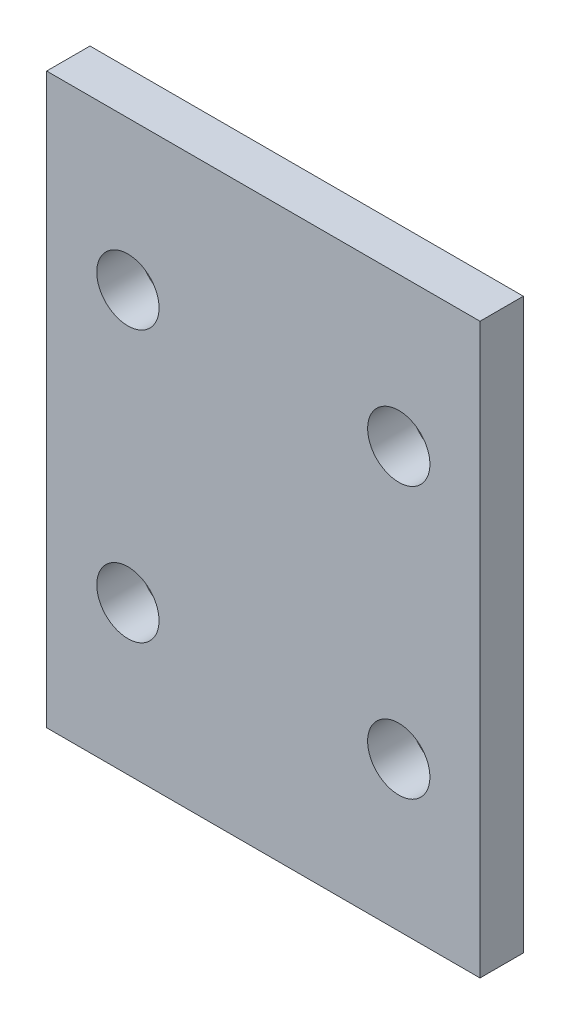
ISO-10303-21;
HEADER;
FILE_DESCRIPTION(('STEP AP214'),'2;1');
FILE_NAME('part.step','',(''),(''),'','','');
FILE_SCHEMA(('AUTOMOTIVE_DESIGN { 1 0 10303 214 1 1 1 1 }'));
ENDSEC;
DATA;
#1=APPLICATION_CONTEXT('core data for automotive mechanical design processes');
#2=APPLICATION_PROTOCOL_DEFINITION('international standard','automotive_design',2000,#1);
#3=PRODUCT_CONTEXT('',#1,'mechanical');
#4=PRODUCT('Part','Part','',(#3));
#5=PRODUCT_RELATED_PRODUCT_CATEGORY('part','',(#4));
#6=PRODUCT_DEFINITION_FORMATION('','',#4);
#7=PRODUCT_DEFINITION_CONTEXT('part definition',#1,'design');
#8=PRODUCT_DEFINITION('design','',#6,#7);
#9=PRODUCT_DEFINITION_SHAPE('','',#8);
#10=(LENGTH_UNIT() NAMED_UNIT(*) SI_UNIT(.MILLI.,.METRE.));
#11=(NAMED_UNIT(*) PLANE_ANGLE_UNIT() SI_UNIT($,.RADIAN.));
#12=(NAMED_UNIT(*) SI_UNIT($,.STERADIAN.) SOLID_ANGLE_UNIT());
#13=UNCERTAINTY_MEASURE_WITH_UNIT(LENGTH_MEASURE(1.E-05),#10,'distance_accuracy_value','');
#14=(GEOMETRIC_REPRESENTATION_CONTEXT(3) GLOBAL_UNCERTAINTY_ASSIGNED_CONTEXT((#13)) GLOBAL_UNIT_ASSIGNED_CONTEXT((#10,
#11,#12)) REPRESENTATION_CONTEXT('',''));
#15=CARTESIAN_POINT('',(0.,0.,0.));
#16=DIRECTION('',(0.,0.,1.));
#17=DIRECTION('',(1.,0.,0.));
#18=AXIS2_PLACEMENT_3D('',#15,#16,#17);
#19=CARTESIAN_POINT('',(0.,0.,-16.));
#20=DIRECTION('',(-1.,0.,0.));
#21=DIRECTION('',(0.,-1.,0.));
#22=AXIS2_PLACEMENT_3D('',#19,#20,#21);
#23=PLANE('',#22);
#24=DIRECTION('',(0.,-1.,0.));
#25=VECTOR('',#24,1.);
#26=CARTESIAN_POINT('',(0.,0.,0.));
#27=LINE('',#26,#25);
#28=CARTESIAN_POINT('',(0.,0.,0.));
#29=VERTEX_POINT('',#28);
#30=CARTESIAN_POINT('',(0.,-210.,0.));
#31=VERTEX_POINT('',#30);
#32=EDGE_CURVE('E101',#29,#31,#27,.T.);
#33=ORIENTED_EDGE('',*,*,#32,.F.);
#34=DIRECTION('',(0.,0.,1.));
#35=VECTOR('',#34,1.);
#36=CARTESIAN_POINT('',(0.,0.,-16.));
#37=LINE('',#36,#35);
#38=CARTESIAN_POINT('',(0.,0.,-16.));
#39=VERTEX_POINT('',#38);
#40=EDGE_CURVE('E11',#39,#29,#37,.T.);
#41=ORIENTED_EDGE('',*,*,#40,.F.);
#42=DIRECTION('',(0.,-1.,0.));
#43=VECTOR('',#42,1.);
#44=CARTESIAN_POINT('',(0.,0.,-16.));
#45=LINE('',#44,#43);
#46=CARTESIAN_POINT('',(0.,-210.,-16.));
#47=VERTEX_POINT('',#46);
#48=EDGE_CURVE('E94',#39,#47,#45,.T.);
#49=ORIENTED_EDGE('',*,*,#48,.T.);
#50=DIRECTION('',(0.,0.,1.));
#51=VECTOR('',#50,1.);
#52=CARTESIAN_POINT('',(0.,-210.,-16.));
#53=LINE('',#52,#51);
#54=EDGE_CURVE('E39',#47,#31,#53,.T.);
#55=ORIENTED_EDGE('',*,*,#54,.T.);
#56=EDGE_LOOP('',(#33,#41,#49,#55));
#57=FACE_BOUND('',#56,.T.);
#58=ADVANCED_FACE('F36',(#57),#23,.T.);
#59=CARTESIAN_POINT('',(0.,0.,-16.));
#60=DIRECTION('',(0.,1.,0.));
#61=DIRECTION('',(0.,0.,1.));
#62=AXIS2_PLACEMENT_3D('',#59,#60,#61);
#63=PLANE('',#62);
#64=DIRECTION('',(-1.,0.,0.));
#65=VECTOR('',#64,1.);
#66=CARTESIAN_POINT('',(0.,0.,0.));
#67=LINE('',#66,#65);
#68=CARTESIAN_POINT('',(160.,0.,0.));
#69=VERTEX_POINT('',#68);
#70=EDGE_CURVE('E96',#69,#29,#67,.T.);
#71=ORIENTED_EDGE('',*,*,#70,.F.);
#72=DIRECTION('',(0.,0.,1.));
#73=VECTOR('',#72,1.);
#74=CARTESIAN_POINT('',(160.,0.,-16.));
#75=LINE('',#74,#73);
#76=CARTESIAN_POINT('',(160.,0.,-16.));
#77=VERTEX_POINT('',#76);
#78=EDGE_CURVE('E45',#77,#69,#75,.T.);
#79=ORIENTED_EDGE('',*,*,#78,.F.);
#80=DIRECTION('',(-1.,0.,0.));
#81=VECTOR('',#80,1.);
#82=CARTESIAN_POINT('',(0.,0.,-16.));
#83=LINE('',#82,#81);
#84=EDGE_CURVE('E91',#77,#39,#83,.T.);
#85=ORIENTED_EDGE('',*,*,#84,.T.);
#86=ORIENTED_EDGE('',*,*,#40,.T.);
#87=EDGE_LOOP('',(#71,#79,#85,#86));
#88=FACE_BOUND('',#87,.T.);
#89=ADVANCED_FACE('F112',(#88),#63,.T.);
#90=CARTESIAN_POINT('',(160.,0.,-16.));
#91=DIRECTION('',(1.,0.,0.));
#92=DIRECTION('',(0.,0.,-1.));
#93=AXIS2_PLACEMENT_3D('',#90,#91,#92);
#94=PLANE('',#93);
#95=DIRECTION('',(0.,1.,0.));
#96=VECTOR('',#95,1.);
#97=CARTESIAN_POINT('',(160.,0.,0.));
#98=LINE('',#97,#96);
#99=CARTESIAN_POINT('',(160.,-210.,0.));
#100=VERTEX_POINT('',#99);
#101=EDGE_CURVE('E86',#100,#69,#98,.T.);
#102=ORIENTED_EDGE('',*,*,#101,.F.);
#103=DIRECTION('',(0.,0.,1.));
#104=VECTOR('',#103,1.);
#105=CARTESIAN_POINT('',(160.,-210.,-16.));
#106=LINE('',#105,#104);
#107=CARTESIAN_POINT('',(160.,-210.,-16.));
#108=VERTEX_POINT('',#107);
#109=EDGE_CURVE('E81',#108,#100,#106,.T.);
#110=ORIENTED_EDGE('',*,*,#109,.F.);
#111=DIRECTION('',(0.,1.,0.));
#112=VECTOR('',#111,1.);
#113=CARTESIAN_POINT('',(160.,0.,-16.));
#114=LINE('',#113,#112);
#115=EDGE_CURVE('E84',#108,#77,#114,.T.);
#116=ORIENTED_EDGE('',*,*,#115,.T.);
#117=ORIENTED_EDGE('',*,*,#78,.T.);
#118=EDGE_LOOP('',(#102,#110,#116,#117));
#119=FACE_BOUND('',#118,.T.);
#120=ADVANCED_FACE('F83',(#119),#94,.T.);
#121=CARTESIAN_POINT('',(0.,-210.,-16.));
#122=DIRECTION('',(0.,-1.,0.));
#123=DIRECTION('',(0.,0.,-1.));
#124=AXIS2_PLACEMENT_3D('',#121,#122,#123);
#125=PLANE('',#124);
#126=DIRECTION('',(1.,0.,0.));
#127=VECTOR('',#126,1.);
#128=CARTESIAN_POINT('',(0.,-210.,0.));
#129=LINE('',#128,#127);
#130=EDGE_CURVE('E104',#31,#100,#129,.T.);
#131=ORIENTED_EDGE('',*,*,#130,.F.);
#132=ORIENTED_EDGE('',*,*,#54,.F.);
#133=DIRECTION('',(1.,0.,0.));
#134=VECTOR('',#133,1.);
#135=CARTESIAN_POINT('',(0.,-210.,-16.));
#136=LINE('',#135,#134);
#137=EDGE_CURVE('E90',#47,#108,#136,.T.);
#138=ORIENTED_EDGE('',*,*,#137,.T.);
#139=ORIENTED_EDGE('',*,*,#109,.T.);
#140=EDGE_LOOP('',(#131,#132,#138,#139));
#141=FACE_BOUND('',#140,.T.);
#142=ADVANCED_FACE('F93',(#141),#125,.T.);
#143=CARTESIAN_POINT('',(0.,0.,-16.));
#144=DIRECTION('',(0.,0.,1.));
#145=DIRECTION('',(1.,0.,0.));
#146=AXIS2_PLACEMENT_3D('',#143,#144,#145);
#147=PLANE('',#146);
#148=CARTESIAN_POINT('',(30.0000000000002,-155.,-16.));
#149=DIRECTION('',(0.,0.,1.));
#150=DIRECTION('',(-1.,0.,0.));
#151=AXIS2_PLACEMENT_3D('',#148,#149,#150);
#152=CIRCLE('',#151,11.5);
#153=CARTESIAN_POINT('',(18.5000000000002,-155.,-16.));
#154=VERTEX_POINT('',#153);
#155=EDGE_CURVE('E153',#154,#154,#152,.T.);
#156=ORIENTED_EDGE('',*,*,#155,.T.);
#157=EDGE_LOOP('',(#156));
#158=FACE_BOUND('',#157,.T.);
#159=CARTESIAN_POINT('',(130.,-155.,-16.));
#160=DIRECTION('',(0.,0.,1.));
#161=DIRECTION('',(1.,0.,0.));
#162=AXIS2_PLACEMENT_3D('',#159,#160,#161);
#163=CIRCLE('',#162,11.5);
#164=CARTESIAN_POINT('',(141.5,-155.,-16.));
#165=VERTEX_POINT('',#164);
#166=EDGE_CURVE('E161',#165,#165,#163,.T.);
#167=ORIENTED_EDGE('',*,*,#166,.T.);
#168=EDGE_LOOP('',(#167));
#169=FACE_BOUND('',#168,.T.);
#170=CARTESIAN_POINT('',(130.,-55.0000000000002,-16.));
#171=DIRECTION('',(0.,0.,1.));
#172=DIRECTION('',(-1.,0.,0.));
#173=AXIS2_PLACEMENT_3D('',#170,#171,#172);
#174=CIRCLE('',#173,11.5);
#175=CARTESIAN_POINT('',(118.5,-55.0000000000002,-16.));
#176=VERTEX_POINT('',#175);
#177=EDGE_CURVE('E167',#176,#176,#174,.T.);
#178=ORIENTED_EDGE('',*,*,#177,.T.);
#179=EDGE_LOOP('',(#178));
#180=FACE_BOUND('',#179,.T.);
#181=CARTESIAN_POINT('',(30.0000000000002,-55.0000000000002,-16.));
#182=DIRECTION('',(0.,0.,1.));
#183=DIRECTION('',(1.,0.,0.));
#184=AXIS2_PLACEMENT_3D('',#181,#182,#183);
#185=CIRCLE('',#184,11.5);
#186=CARTESIAN_POINT('',(41.5000000000002,-55.0000000000002,-16.));
#187=VERTEX_POINT('',#186);
#188=EDGE_CURVE('E105',#187,#187,#185,.T.);
#189=ORIENTED_EDGE('',*,*,#188,.T.);
#190=EDGE_LOOP('',(#189));
#191=FACE_BOUND('',#190,.T.);
#192=ORIENTED_EDGE('',*,*,#48,.F.);
#193=ORIENTED_EDGE('',*,*,#84,.F.);
#194=ORIENTED_EDGE('',*,*,#115,.F.);
#195=ORIENTED_EDGE('',*,*,#137,.F.);
#196=EDGE_LOOP('',(#192,#193,#194,#195));
#197=FACE_BOUND('',#196,.T.);
#198=ADVANCED_FACE('F89',(#158,#169,#180,#191,#197),#147,.F.);
#199=CARTESIAN_POINT('',(0.,0.,0.));
#200=DIRECTION('',(0.,0.,1.));
#201=DIRECTION('',(1.,0.,0.));
#202=AXIS2_PLACEMENT_3D('',#199,#200,#201);
#203=PLANE('',#202);
#204=CARTESIAN_POINT('',(30.0000000000002,-155.,0.));
#205=DIRECTION('',(0.,0.,1.));
#206=DIRECTION('',(-1.,0.,0.));
#207=AXIS2_PLACEMENT_3D('',#204,#205,#206);
#208=CIRCLE('',#207,11.5);
#209=CARTESIAN_POINT('',(18.5000000000002,-155.,0.));
#210=VERTEX_POINT('',#209);
#211=EDGE_CURVE('E156',#210,#210,#208,.T.);
#212=ORIENTED_EDGE('',*,*,#211,.F.);
#213=EDGE_LOOP('',(#212));
#214=FACE_BOUND('',#213,.T.);
#215=CARTESIAN_POINT('',(130.,-155.,0.));
#216=DIRECTION('',(0.,0.,1.));
#217=DIRECTION('',(1.,0.,0.));
#218=AXIS2_PLACEMENT_3D('',#215,#216,#217);
#219=CIRCLE('',#218,11.5);
#220=CARTESIAN_POINT('',(141.5,-155.,0.));
#221=VERTEX_POINT('',#220);
#222=EDGE_CURVE('E158',#221,#221,#219,.T.);
#223=ORIENTED_EDGE('',*,*,#222,.F.);
#224=EDGE_LOOP('',(#223));
#225=FACE_BOUND('',#224,.T.);
#226=CARTESIAN_POINT('',(130.,-55.0000000000002,0.));
#227=DIRECTION('',(0.,0.,1.));
#228=DIRECTION('',(-1.,0.,0.));
#229=AXIS2_PLACEMENT_3D('',#226,#227,#228);
#230=CIRCLE('',#229,11.5);
#231=CARTESIAN_POINT('',(118.5,-55.0000000000002,0.));
#232=VERTEX_POINT('',#231);
#233=EDGE_CURVE('E164',#232,#232,#230,.T.);
#234=ORIENTED_EDGE('',*,*,#233,.F.);
#235=EDGE_LOOP('',(#234));
#236=FACE_BOUND('',#235,.T.);
#237=CARTESIAN_POINT('',(30.0000000000002,-55.0000000000002,0.));
#238=DIRECTION('',(0.,0.,1.));
#239=DIRECTION('',(1.,0.,0.));
#240=AXIS2_PLACEMENT_3D('',#237,#238,#239);
#241=CIRCLE('',#240,11.5);
#242=CARTESIAN_POINT('',(41.5000000000002,-55.0000000000002,0.));
#243=VERTEX_POINT('',#242);
#244=EDGE_CURVE('E170',#243,#243,#241,.T.);
#245=ORIENTED_EDGE('',*,*,#244,.F.);
#246=EDGE_LOOP('',(#245));
#247=FACE_BOUND('',#246,.T.);
#248=ORIENTED_EDGE('',*,*,#32,.T.);
#249=ORIENTED_EDGE('',*,*,#130,.T.);
#250=ORIENTED_EDGE('',*,*,#101,.T.);
#251=ORIENTED_EDGE('',*,*,#70,.T.);
#252=EDGE_LOOP('',(#248,#249,#250,#251));
#253=FACE_BOUND('',#252,.T.);
#254=ADVANCED_FACE('F111',(#214,#225,#236,#247,#253),#203,.T.);
#255=CARTESIAN_POINT('',(30.0000000000002,-55.0000000000002,-16.));
#256=DIRECTION('',(0.,0.,1.));
#257=DIRECTION('',(1.,0.,0.));
#258=AXIS2_PLACEMENT_3D('',#255,#256,#257);
#259=CYLINDRICAL_SURFACE('',#258,11.5);
#260=ORIENTED_EDGE('',*,*,#188,.F.);
#261=EDGE_LOOP('',(#260));
#262=FACE_BOUND('',#261,.T.);
#263=ORIENTED_EDGE('',*,*,#244,.T.);
#264=EDGE_LOOP('',(#263));
#265=FACE_BOUND('',#264,.T.);
#266=ADVANCED_FACE('F130',(#262,#265),#259,.F.);
#267=CARTESIAN_POINT('',(130.,-55.0000000000002,-16.));
#268=DIRECTION('',(0.,0.,1.));
#269=DIRECTION('',(1.,0.,0.));
#270=AXIS2_PLACEMENT_3D('',#267,#268,#269);
#271=CYLINDRICAL_SURFACE('',#270,11.5);
#272=ORIENTED_EDGE('',*,*,#177,.F.);
#273=EDGE_LOOP('',(#272));
#274=FACE_BOUND('',#273,.T.);
#275=ORIENTED_EDGE('',*,*,#233,.T.);
#276=EDGE_LOOP('',(#275));
#277=FACE_BOUND('',#276,.T.);
#278=ADVANCED_FACE('F137',(#274,#277),#271,.F.);
#279=CARTESIAN_POINT('',(130.,-155.,-16.));
#280=DIRECTION('',(0.,0.,1.));
#281=DIRECTION('',(1.,0.,0.));
#282=AXIS2_PLACEMENT_3D('',#279,#280,#281);
#283=CYLINDRICAL_SURFACE('',#282,11.5);
#284=ORIENTED_EDGE('',*,*,#166,.F.);
#285=EDGE_LOOP('',(#284));
#286=FACE_BOUND('',#285,.T.);
#287=ORIENTED_EDGE('',*,*,#222,.T.);
#288=EDGE_LOOP('',(#287));
#289=FACE_BOUND('',#288,.T.);
#290=ADVANCED_FACE('F141',(#286,#289),#283,.F.);
#291=CARTESIAN_POINT('',(30.0000000000002,-155.,-16.));
#292=DIRECTION('',(0.,0.,1.));
#293=DIRECTION('',(1.,0.,0.));
#294=AXIS2_PLACEMENT_3D('',#291,#292,#293);
#295=CYLINDRICAL_SURFACE('',#294,11.5);
#296=ORIENTED_EDGE('',*,*,#155,.F.);
#297=EDGE_LOOP('',(#296));
#298=FACE_BOUND('',#297,.T.);
#299=ORIENTED_EDGE('',*,*,#211,.T.);
#300=EDGE_LOOP('',(#299));
#301=FACE_BOUND('',#300,.T.);
#302=ADVANCED_FACE('F145',(#298,#301),#295,.F.);
#303=CLOSED_SHELL('',(#58,#89,#120,#142,#198,#254,#266,#278,#290,#302));
#304=MANIFOLD_SOLID_BREP('B2',#303);
#305=ADVANCED_BREP_SHAPE_REPRESENTATION('',(#18,#304),#14);
#306=SHAPE_DEFINITION_REPRESENTATION(#9,#305);
ENDSEC;
END-ISO-10303-21;
